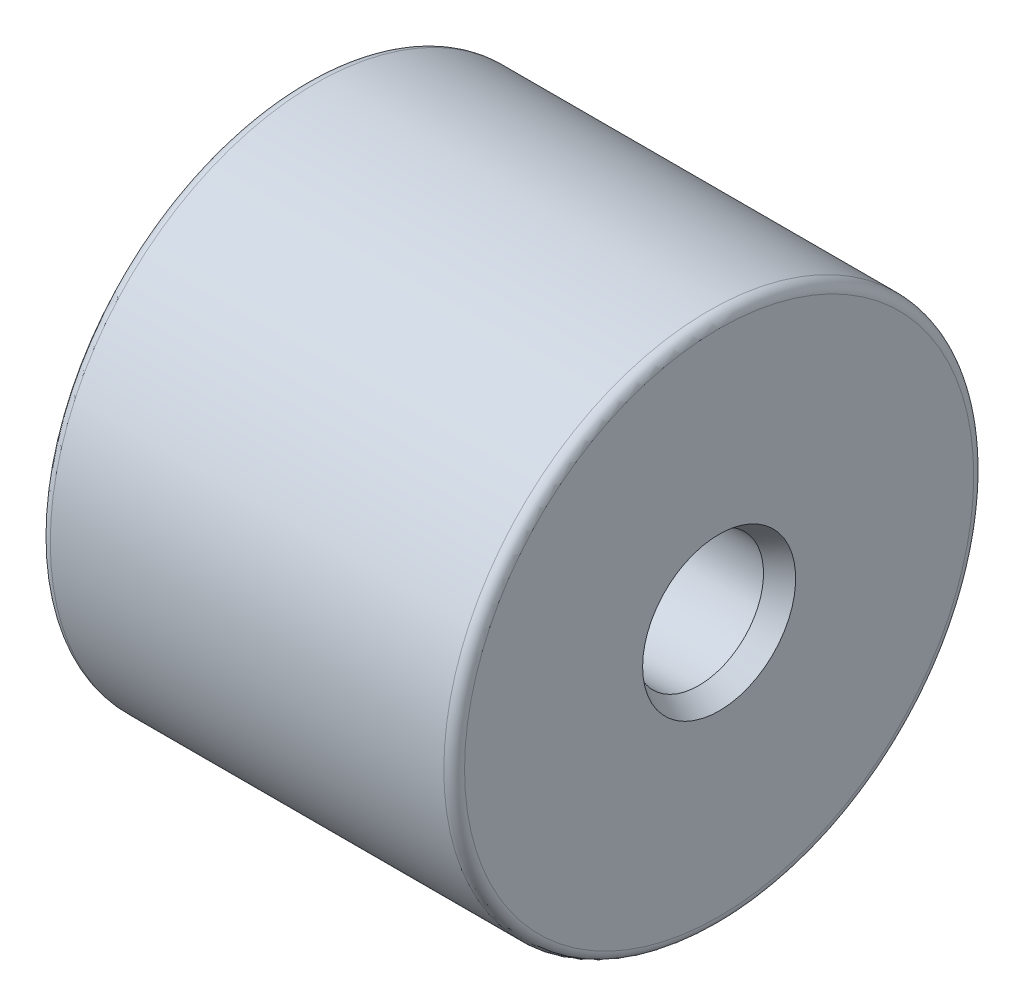
ISO-10303-21;
HEADER;
FILE_DESCRIPTION(('STEP AP214'),'2;1');
FILE_NAME('part.step','',(''),(''),'','','');
FILE_SCHEMA(('AUTOMOTIVE_DESIGN { 1 0 10303 214 1 1 1 1 }'));
ENDSEC;
DATA;
#1=APPLICATION_CONTEXT('core data for automotive mechanical design processes');
#2=APPLICATION_PROTOCOL_DEFINITION('international standard','automotive_design',2000,#1);
#3=PRODUCT_CONTEXT('',#1,'mechanical');
#4=PRODUCT('Part','Part','',(#3));
#5=PRODUCT_RELATED_PRODUCT_CATEGORY('part','',(#4));
#6=PRODUCT_DEFINITION_FORMATION('','',#4);
#7=PRODUCT_DEFINITION_CONTEXT('part definition',#1,'design');
#8=PRODUCT_DEFINITION('design','',#6,#7);
#9=PRODUCT_DEFINITION_SHAPE('','',#8);
#10=(LENGTH_UNIT() NAMED_UNIT(*) SI_UNIT(.MILLI.,.METRE.));
#11=(NAMED_UNIT(*) PLANE_ANGLE_UNIT() SI_UNIT($,.RADIAN.));
#12=(NAMED_UNIT(*) SI_UNIT($,.STERADIAN.) SOLID_ANGLE_UNIT());
#13=UNCERTAINTY_MEASURE_WITH_UNIT(LENGTH_MEASURE(1.E-05),#10,'distance_accuracy_value','');
#14=(GEOMETRIC_REPRESENTATION_CONTEXT(3) GLOBAL_UNCERTAINTY_ASSIGNED_CONTEXT((#13)) GLOBAL_UNIT_ASSIGNED_CONTEXT((#10,
#11,#12)) REPRESENTATION_CONTEXT('',''));
#15=CARTESIAN_POINT('',(0.,0.,0.));
#16=DIRECTION('',(0.,0.,1.));
#17=DIRECTION('',(1.,0.,0.));
#18=AXIS2_PLACEMENT_3D('',#15,#16,#17);
#19=CARTESIAN_POINT('',(-15.24,4.765,0.));
#20=DIRECTION('',(1.,0.,0.));
#21=DIRECTION('',(0.,0.,-1.));
#22=AXIS2_PLACEMENT_3D('',#19,#20,#21);
#23=PLANE('',#22);
#24=CARTESIAN_POINT('',(-15.24,0.,0.));
#25=DIRECTION('',(1.,0.,0.));
#26=DIRECTION('',(0.,0.,-1.));
#27=AXIS2_PLACEMENT_3D('',#24,#25,#26);
#28=CIRCLE('',#27,18.7325);
#29=CARTESIAN_POINT('',(-15.24,0.,-18.7325));
#30=VERTEX_POINT('',#29);
#31=EDGE_CURVE('E45',#30,#30,#28,.F.);
#32=ORIENTED_EDGE('',*,*,#31,.T.);
#33=EDGE_LOOP('',(#32));
#34=FACE_BOUND('',#33,.T.);
#35=CARTESIAN_POINT('',(-15.24,0.,0.));
#36=DIRECTION('',(1.,0.,0.));
#37=DIRECTION('',(0.,0.,-1.));
#38=AXIS2_PLACEMENT_3D('',#35,#36,#37);
#39=CIRCLE('',#38,5.63102540378443);
#40=CARTESIAN_POINT('',(-15.24,0.,-5.63102540378443));
#41=VERTEX_POINT('',#40);
#42=EDGE_CURVE('E60',#41,#41,#39,.T.);
#43=ORIENTED_EDGE('',*,*,#42,.T.);
#44=EDGE_LOOP('',(#43));
#45=FACE_BOUND('',#44,.T.);
#46=ADVANCED_FACE('F33',(#34,#45),#23,.F.);
#47=CARTESIAN_POINT('',(-1000.,0.,0.));
#48=DIRECTION('',(-1.,0.,0.));
#49=DIRECTION('',(0.,0.,1.));
#50=AXIS2_PLACEMENT_3D('',#47,#48,#49);
#51=CYLINDRICAL_SURFACE('',#50,19.4945);
#52=CARTESIAN_POINT('',(14.478,0.,0.));
#53=DIRECTION('',(-1.,0.,0.));
#54=DIRECTION('',(0.,0.,1.));
#55=AXIS2_PLACEMENT_3D('',#52,#53,#54);
#56=CIRCLE('',#55,19.4945);
#57=CARTESIAN_POINT('',(14.478,0.,19.4945));
#58=VERTEX_POINT('',#57);
#59=EDGE_CURVE('E54',#58,#58,#56,.T.);
#60=ORIENTED_EDGE('',*,*,#59,.T.);
#61=EDGE_LOOP('',(#60));
#62=FACE_BOUND('',#61,.T.);
#63=CARTESIAN_POINT('',(-14.478,0.,0.));
#64=DIRECTION('',(1.,0.,0.));
#65=DIRECTION('',(0.,0.,-1.));
#66=AXIS2_PLACEMENT_3D('',#63,#64,#65);
#67=CIRCLE('',#66,19.4945);
#68=CARTESIAN_POINT('',(-14.478,0.,-19.4945));
#69=VERTEX_POINT('',#68);
#70=EDGE_CURVE('E57',#69,#69,#67,.T.);
#71=ORIENTED_EDGE('',*,*,#70,.T.);
#72=EDGE_LOOP('',(#71));
#73=FACE_BOUND('',#72,.T.);
#74=ADVANCED_FACE('F87',(#62,#73),#51,.T.);
#75=CARTESIAN_POINT('',(15.24,19.4945,0.));
#76=DIRECTION('',(-1.,0.,0.));
#77=DIRECTION('',(0.,0.,1.));
#78=AXIS2_PLACEMENT_3D('',#75,#76,#77);
#79=PLANE('',#78);
#80=CARTESIAN_POINT('',(15.24,0.,0.));
#81=DIRECTION('',(-1.,0.,0.));
#82=DIRECTION('',(0.,0.,1.));
#83=AXIS2_PLACEMENT_3D('',#80,#81,#82);
#84=CIRCLE('',#83,5.63102540378457);
#85=CARTESIAN_POINT('',(15.24,0.,5.63102540378457));
#86=VERTEX_POINT('',#85);
#87=EDGE_CURVE('E41',#86,#86,#84,.T.);
#88=ORIENTED_EDGE('',*,*,#87,.T.);
#89=EDGE_LOOP('',(#88));
#90=FACE_BOUND('',#89,.T.);
#91=CARTESIAN_POINT('',(15.24,0.,0.));
#92=DIRECTION('',(-1.,0.,0.));
#93=DIRECTION('',(0.,0.,1.));
#94=AXIS2_PLACEMENT_3D('',#91,#92,#93);
#95=CIRCLE('',#94,18.7325);
#96=CARTESIAN_POINT('',(15.24,0.,18.7325));
#97=VERTEX_POINT('',#96);
#98=EDGE_CURVE('E49',#97,#97,#95,.F.);
#99=ORIENTED_EDGE('',*,*,#98,.T.);
#100=EDGE_LOOP('',(#99));
#101=FACE_BOUND('',#100,.T.);
#102=ADVANCED_FACE('F81',(#90,#101),#79,.F.);
#103=CARTESIAN_POINT('',(-1000.,0.,0.));
#104=DIRECTION('',(-1.,0.,0.));
#105=DIRECTION('',(0.,0.,1.));
#106=AXIS2_PLACEMENT_3D('',#103,#104,#105);
#107=CYLINDRICAL_SURFACE('',#106,4.765);
#108=CARTESIAN_POINT('',(13.7399999999999,0.,0.));
#109=DIRECTION('',(-1.,0.,0.));
#110=DIRECTION('',(0.,0.,1.));
#111=AXIS2_PLACEMENT_3D('',#108,#109,#110);
#112=CIRCLE('',#111,4.765);
#113=CARTESIAN_POINT('',(13.7399999999999,0.,4.765));
#114=VERTEX_POINT('',#113);
#115=EDGE_CURVE('E10',#114,#114,#112,.F.);
#116=ORIENTED_EDGE('',*,*,#115,.T.);
#117=EDGE_LOOP('',(#116));
#118=FACE_BOUND('',#117,.T.);
#119=CARTESIAN_POINT('',(-13.74,0.,0.));
#120=DIRECTION('',(1.,0.,0.));
#121=DIRECTION('',(0.,0.,-1.));
#122=AXIS2_PLACEMENT_3D('',#119,#120,#121);
#123=CIRCLE('',#122,4.765);
#124=CARTESIAN_POINT('',(-13.74,0.,-4.765));
#125=VERTEX_POINT('',#124);
#126=EDGE_CURVE('E63',#125,#125,#123,.F.);
#127=ORIENTED_EDGE('',*,*,#126,.T.);
#128=EDGE_LOOP('',(#127));
#129=FACE_BOUND('',#128,.T.);
#130=ADVANCED_FACE('F67',(#118,#129),#107,.F.);
#131=CARTESIAN_POINT('',(-13.74,0.,0.));
#132=DIRECTION('',(-1.,0.,0.));
#133=DIRECTION('',(0.,0.,1.));
#134=AXIS2_PLACEMENT_3D('',#131,#132,#133);
#135=CONICAL_SURFACE('',#134,4.765,0.523598775598288);
#136=ORIENTED_EDGE('',*,*,#42,.F.);
#137=EDGE_LOOP('',(#136));
#138=FACE_BOUND('',#137,.T.);
#139=ORIENTED_EDGE('',*,*,#126,.F.);
#140=EDGE_LOOP('',(#139));
#141=FACE_BOUND('',#140,.T.);
#142=ADVANCED_FACE('F69',(#138,#141),#135,.F.);
#143=CARTESIAN_POINT('',(14.478,0.,0.));
#144=DIRECTION('',(-1.,0.,0.));
#145=DIRECTION('',(0.,0.,1.));
#146=AXIS2_PLACEMENT_3D('',#143,#144,#145);
#147=TOROIDAL_SURFACE('',#146,18.7325,0.762);
#148=ORIENTED_EDGE('',*,*,#98,.F.);
#149=EDGE_LOOP('',(#148));
#150=FACE_BOUND('',#149,.T.);
#151=ORIENTED_EDGE('',*,*,#59,.F.);
#152=EDGE_LOOP('',(#151));
#153=FACE_BOUND('',#152,.T.);
#154=ADVANCED_FACE('F71',(#150,#153),#147,.T.);
#155=CARTESIAN_POINT('',(-14.478,0.,0.));
#156=DIRECTION('',(1.,0.,0.));
#157=DIRECTION('',(0.,0.,-1.));
#158=AXIS2_PLACEMENT_3D('',#155,#156,#157);
#159=TOROIDAL_SURFACE('',#158,18.7325,0.762);
#160=ORIENTED_EDGE('',*,*,#70,.F.);
#161=EDGE_LOOP('',(#160));
#162=FACE_BOUND('',#161,.T.);
#163=ORIENTED_EDGE('',*,*,#31,.F.);
#164=EDGE_LOOP('',(#163));
#165=FACE_BOUND('',#164,.T.);
#166=ADVANCED_FACE('F78',(#162,#165),#159,.T.);
#167=CARTESIAN_POINT('',(15.2399999999999,0.,0.));
#168=DIRECTION('',(1.,0.,0.));
#169=DIRECTION('',(0.,0.,-1.));
#170=AXIS2_PLACEMENT_3D('',#167,#168,#169);
#171=CONICAL_SURFACE('',#170,5.63102540378453,0.523598775598329);
#172=ORIENTED_EDGE('',*,*,#115,.F.);
#173=EDGE_LOOP('',(#172));
#174=FACE_BOUND('',#173,.T.);
#175=ORIENTED_EDGE('',*,*,#87,.F.);
#176=EDGE_LOOP('',(#175));
#177=FACE_BOUND('',#176,.T.);
#178=ADVANCED_FACE('F36',(#174,#177),#171,.F.);
#179=CLOSED_SHELL('',(#46,#74,#102,#130,#142,#154,#166,#178));
#180=MANIFOLD_SOLID_BREP('B2',#179);
#181=ADVANCED_BREP_SHAPE_REPRESENTATION('',(#18,#180),#14);
#182=SHAPE_DEFINITION_REPRESENTATION(#9,#181);
ENDSEC;
END-ISO-10303-21;
